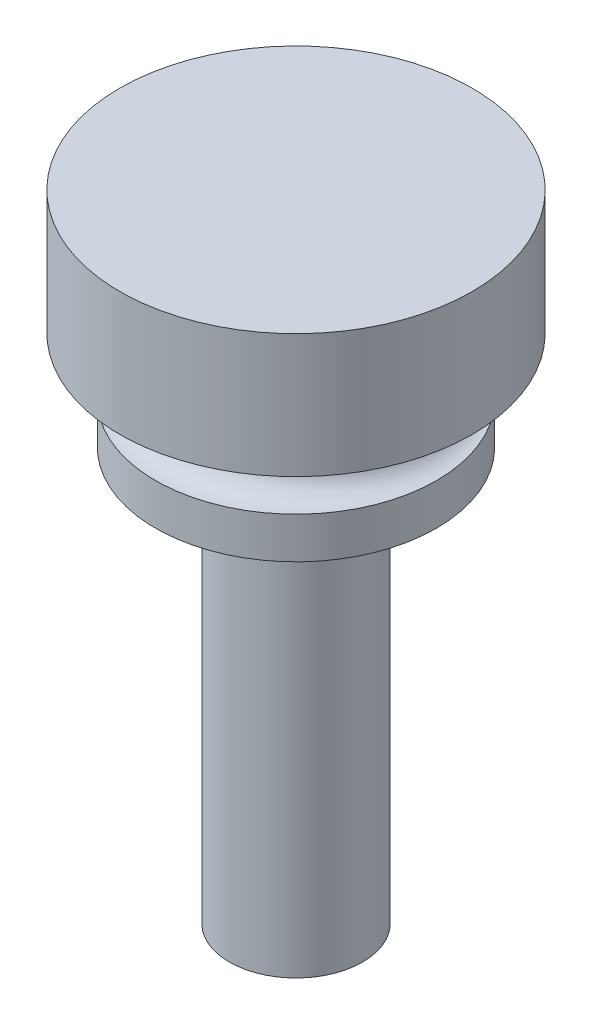
ISO-10303-21;
HEADER;
FILE_DESCRIPTION(('STEP AP214'),'2;1');
FILE_NAME('part.step','',(''),(''),'','','');
FILE_SCHEMA(('AUTOMOTIVE_DESIGN { 1 0 10303 214 1 1 1 1 }'));
ENDSEC;
DATA;
#1=APPLICATION_CONTEXT('core data for automotive mechanical design processes');
#2=APPLICATION_PROTOCOL_DEFINITION('international standard','automotive_design',2000,#1);
#3=PRODUCT_CONTEXT('',#1,'mechanical');
#4=PRODUCT('Part','Part','',(#3));
#5=PRODUCT_RELATED_PRODUCT_CATEGORY('part','',(#4));
#6=PRODUCT_DEFINITION_FORMATION('','',#4);
#7=PRODUCT_DEFINITION_CONTEXT('part definition',#1,'design');
#8=PRODUCT_DEFINITION('design','',#6,#7);
#9=PRODUCT_DEFINITION_SHAPE('','',#8);
#10=(LENGTH_UNIT() NAMED_UNIT(*) SI_UNIT(.MILLI.,.METRE.));
#11=(NAMED_UNIT(*) PLANE_ANGLE_UNIT() SI_UNIT($,.RADIAN.));
#12=(NAMED_UNIT(*) SI_UNIT($,.STERADIAN.) SOLID_ANGLE_UNIT());
#13=UNCERTAINTY_MEASURE_WITH_UNIT(LENGTH_MEASURE(1.E-05),#10,'distance_accuracy_value','');
#14=(GEOMETRIC_REPRESENTATION_CONTEXT(3) GLOBAL_UNCERTAINTY_ASSIGNED_CONTEXT((#13)) GLOBAL_UNIT_ASSIGNED_CONTEXT((#10,
#11,#12)) REPRESENTATION_CONTEXT('',''));
#15=CARTESIAN_POINT('',(0.,0.,0.));
#16=DIRECTION('',(0.,0.,1.));
#17=DIRECTION('',(1.,0.,0.));
#18=AXIS2_PLACEMENT_3D('',#15,#16,#17);
#19=CARTESIAN_POINT('',(0.,-12.7,0.));
#20=DIRECTION('',(0.,-1.,0.));
#21=DIRECTION('',(1.,0.,0.));
#22=AXIS2_PLACEMENT_3D('',#19,#20,#21);
#23=PLANE('',#22);
#24=CARTESIAN_POINT('',(0.,-12.7,0.));
#25=DIRECTION('',(0.,-1.,0.));
#26=DIRECTION('',(1.,0.,0.));
#27=AXIS2_PLACEMENT_3D('',#24,#25,#26);
#28=CIRCLE('',#27,2.05105);
#29=CARTESIAN_POINT('',(2.05105000000001,-12.7,0.));
#30=VERTEX_POINT('',#29);
#31=EDGE_CURVE('E18',#30,#30,#28,.F.);
#32=ORIENTED_EDGE('',*,*,#31,.F.);
#33=EDGE_LOOP('',(#32));
#34=FACE_BOUND('',#33,.T.);
#35=ADVANCED_FACE('F15',(#34),#23,.T.);
#36=CARTESIAN_POINT('',(0.,-12.7,0.));
#37=DIRECTION('',(0.,-1.,0.));
#38=DIRECTION('',(1.,0.,0.));
#39=AXIS2_PLACEMENT_3D('',#36,#37,#38);
#40=CYLINDRICAL_SURFACE('',#39,2.05105);
#41=CARTESIAN_POINT('',(0.,0.,0.));
#42=DIRECTION('',(0.,-1.,0.));
#43=DIRECTION('',(1.,0.,0.));
#44=AXIS2_PLACEMENT_3D('',#41,#42,#43);
#45=CIRCLE('',#44,2.05105);
#46=CARTESIAN_POINT('',(2.05105000000001,0.,0.));
#47=VERTEX_POINT('',#46);
#48=EDGE_CURVE('E38',#47,#47,#45,.F.);
#49=ORIENTED_EDGE('',*,*,#48,.F.);
#50=EDGE_LOOP('',(#49));
#51=FACE_BOUND('',#50,.T.);
#52=ORIENTED_EDGE('',*,*,#31,.T.);
#53=EDGE_LOOP('',(#52));
#54=FACE_BOUND('',#53,.T.);
#55=ADVANCED_FACE('F45',(#51,#54),#40,.T.);
#56=CARTESIAN_POINT('',(2.05105000000001,0.,0.));
#57=DIRECTION('',(0.,-1.,0.));
#58=DIRECTION('',(1.,0.,0.));
#59=AXIS2_PLACEMENT_3D('',#56,#57,#58);
#60=PLANE('',#59);
#61=ORIENTED_EDGE('',*,*,#48,.T.);
#62=EDGE_LOOP('',(#61));
#63=FACE_BOUND('',#62,.T.);
#64=CARTESIAN_POINT('',(0.,0.,0.));
#65=DIRECTION('',(0.,-1.,0.));
#66=DIRECTION('',(1.,0.,0.));
#67=AXIS2_PLACEMENT_3D('',#64,#65,#66);
#68=CIRCLE('',#67,4.32434999999999);
#69=CARTESIAN_POINT('',(4.32435,0.,0.));
#70=VERTEX_POINT('',#69);
#71=EDGE_CURVE('E36',#70,#70,#68,.F.);
#72=ORIENTED_EDGE('',*,*,#71,.F.);
#73=EDGE_LOOP('',(#72));
#74=FACE_BOUND('',#73,.T.);
#75=ADVANCED_FACE('F51',(#63,#74),#60,.T.);
#76=CARTESIAN_POINT('',(0.,-12.7,0.));
#77=DIRECTION('',(0.,-1.,0.));
#78=DIRECTION('',(1.,0.,0.));
#79=AXIS2_PLACEMENT_3D('',#76,#77,#78);
#80=CYLINDRICAL_SURFACE('',#79,4.32434999999999);
#81=CARTESIAN_POINT('',(0.,1.27,0.));
#82=DIRECTION('',(0.,-1.,0.));
#83=DIRECTION('',(1.,0.,0.));
#84=AXIS2_PLACEMENT_3D('',#81,#82,#83);
#85=CIRCLE('',#84,4.32434999999999);
#86=CARTESIAN_POINT('',(4.32435,1.27,0.));
#87=VERTEX_POINT('',#86);
#88=EDGE_CURVE('E30',#87,#87,#85,.T.);
#89=ORIENTED_EDGE('',*,*,#88,.T.);
#90=EDGE_LOOP('',(#89));
#91=FACE_BOUND('',#90,.T.);
#92=ORIENTED_EDGE('',*,*,#71,.T.);
#93=EDGE_LOOP('',(#92));
#94=FACE_BOUND('',#93,.T.);
#95=ADVANCED_FACE('F75',(#91,#94),#80,.T.);
#96=CARTESIAN_POINT('',(0.,2.032,0.));
#97=DIRECTION('',(0.,-1.,0.));
#98=DIRECTION('',(1.,0.,0.));
#99=AXIS2_PLACEMENT_3D('',#96,#97,#98);
#100=TOROIDAL_SURFACE('',#99,4.32435,0.762000000000003);
#101=ORIENTED_EDGE('',*,*,#88,.F.);
#102=EDGE_LOOP('',(#101));
#103=FACE_BOUND('',#102,.T.);
#104=CARTESIAN_POINT('',(0.,2.794,0.));
#105=DIRECTION('',(0.,-1.,0.));
#106=DIRECTION('',(1.,0.,0.));
#107=AXIS2_PLACEMENT_3D('',#104,#105,#106);
#108=CIRCLE('',#107,4.32435);
#109=CARTESIAN_POINT('',(4.32435,2.794,0.));
#110=VERTEX_POINT('',#109);
#111=EDGE_CURVE('E35',#110,#110,#108,.F.);
#112=ORIENTED_EDGE('',*,*,#111,.F.);
#113=EDGE_LOOP('',(#112));
#114=FACE_BOUND('',#113,.T.);
#115=ADVANCED_FACE('F70',(#103,#114),#100,.F.);
#116=CARTESIAN_POINT('',(0.,-12.7,0.));
#117=DIRECTION('',(0.,-1.,0.));
#118=DIRECTION('',(1.,0.,0.));
#119=AXIS2_PLACEMENT_3D('',#116,#117,#118);
#120=CYLINDRICAL_SURFACE('',#119,4.32435);
#121=CARTESIAN_POINT('',(0.,3.048,0.));
#122=DIRECTION('',(0.,-1.,0.));
#123=DIRECTION('',(1.,0.,0.));
#124=AXIS2_PLACEMENT_3D('',#121,#122,#123);
#125=CIRCLE('',#124,4.32435);
#126=CARTESIAN_POINT('',(4.32435,3.048,0.));
#127=VERTEX_POINT('',#126);
#128=EDGE_CURVE('E27',#127,#127,#125,.F.);
#129=ORIENTED_EDGE('',*,*,#128,.F.);
#130=EDGE_LOOP('',(#129));
#131=FACE_BOUND('',#130,.T.);
#132=ORIENTED_EDGE('',*,*,#111,.T.);
#133=EDGE_LOOP('',(#132));
#134=FACE_BOUND('',#133,.T.);
#135=ADVANCED_FACE('F66',(#131,#134),#120,.T.);
#136=CARTESIAN_POINT('',(4.32435,3.048,0.));
#137=DIRECTION('',(0.,-1.,0.));
#138=DIRECTION('',(1.,0.,0.));
#139=AXIS2_PLACEMENT_3D('',#136,#137,#138);
#140=PLANE('',#139);
#141=ORIENTED_EDGE('',*,*,#128,.T.);
#142=EDGE_LOOP('',(#141));
#143=FACE_BOUND('',#142,.T.);
#144=CARTESIAN_POINT('',(0.,3.04800000000001,0.));
#145=DIRECTION('',(0.,-1.,0.));
#146=DIRECTION('',(1.,0.,0.));
#147=AXIS2_PLACEMENT_3D('',#144,#145,#146);
#148=CIRCLE('',#147,5.4229);
#149=CARTESIAN_POINT('',(5.42290000000001,3.04800000000001,0.));
#150=VERTEX_POINT('',#149);
#151=EDGE_CURVE('E22',#150,#150,#148,.F.);
#152=ORIENTED_EDGE('',*,*,#151,.F.);
#153=EDGE_LOOP('',(#152));
#154=FACE_BOUND('',#153,.T.);
#155=ADVANCED_FACE('F60',(#143,#154),#140,.T.);
#156=CARTESIAN_POINT('',(0.,-12.7,0.));
#157=DIRECTION('',(0.,-1.,0.));
#158=DIRECTION('',(1.,0.,0.));
#159=AXIS2_PLACEMENT_3D('',#156,#157,#158);
#160=CYLINDRICAL_SURFACE('',#159,5.4229);
#161=CARTESIAN_POINT('',(0.,6.85800000000001,0.));
#162=DIRECTION('',(0.,-1.,0.));
#163=DIRECTION('',(1.,0.,0.));
#164=AXIS2_PLACEMENT_3D('',#161,#162,#163);
#165=CIRCLE('',#164,5.4229);
#166=CARTESIAN_POINT('',(5.42290000000001,6.85800000000001,0.));
#167=VERTEX_POINT('',#166);
#168=EDGE_CURVE('E9',#167,#167,#165,.F.);
#169=ORIENTED_EDGE('',*,*,#168,.F.);
#170=EDGE_LOOP('',(#169));
#171=FACE_BOUND('',#170,.T.);
#172=ORIENTED_EDGE('',*,*,#151,.T.);
#173=EDGE_LOOP('',(#172));
#174=FACE_BOUND('',#173,.T.);
#175=ADVANCED_FACE('F55',(#171,#174),#160,.T.);
#176=CARTESIAN_POINT('',(5.42290000000001,6.85800000000001,0.));
#177=DIRECTION('',(0.,1.,0.));
#178=DIRECTION('',(-1.,0.,0.));
#179=AXIS2_PLACEMENT_3D('',#176,#177,#178);
#180=PLANE('',#179);
#181=ORIENTED_EDGE('',*,*,#168,.T.);
#182=EDGE_LOOP('',(#181));
#183=FACE_BOUND('',#182,.T.);
#184=ADVANCED_FACE('F53',(#183),#180,.T.);
#185=CLOSED_SHELL('',(#35,#55,#75,#95,#115,#135,#155,#175,#184));
#186=MANIFOLD_SOLID_BREP('B1',#185);
#187=ADVANCED_BREP_SHAPE_REPRESENTATION('',(#18,#186),#14);
#188=SHAPE_DEFINITION_REPRESENTATION(#9,#187);
ENDSEC;
END-ISO-10303-21;
